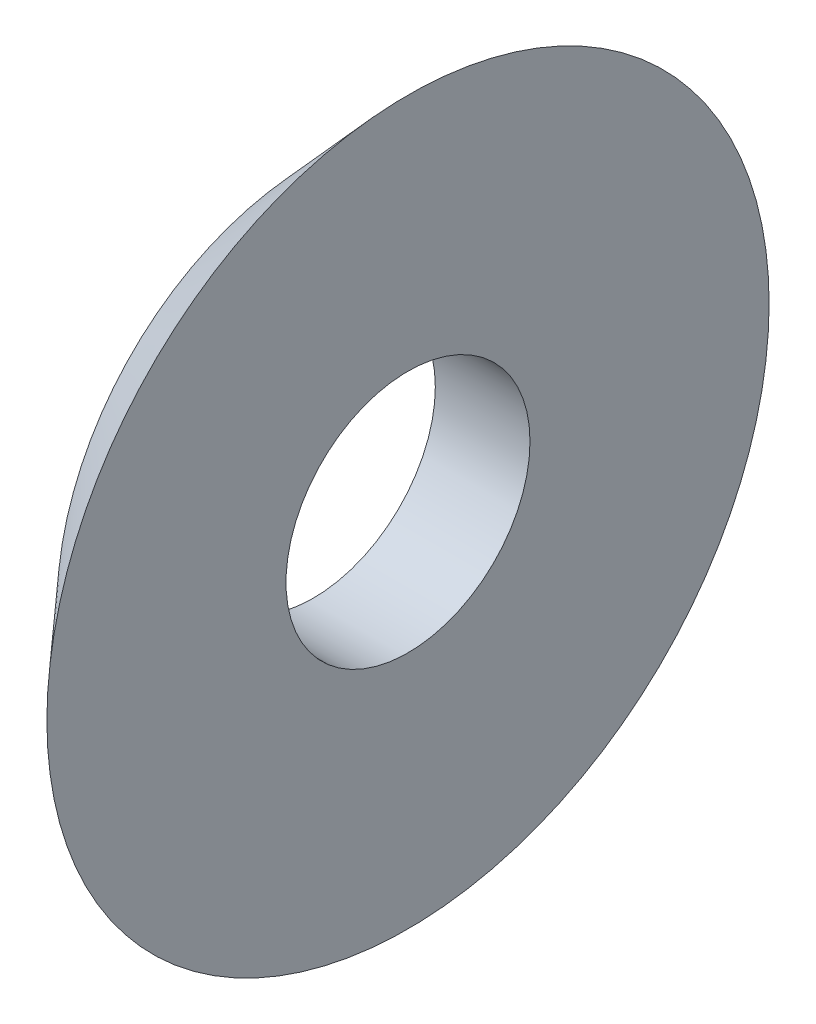
ISO-10303-21;
HEADER;
FILE_DESCRIPTION(('STEP AP214'),'2;1');
FILE_NAME('part.step','',(''),(''),'','','');
FILE_SCHEMA(('AUTOMOTIVE_DESIGN { 1 0 10303 214 1 1 1 1 }'));
ENDSEC;
DATA;
#1=APPLICATION_CONTEXT('core data for automotive mechanical design processes');
#2=APPLICATION_PROTOCOL_DEFINITION('international standard','automotive_design',2000,#1);
#3=PRODUCT_CONTEXT('',#1,'mechanical');
#4=PRODUCT('Part','Part','',(#3));
#5=PRODUCT_RELATED_PRODUCT_CATEGORY('part','',(#4));
#6=PRODUCT_DEFINITION_FORMATION('','',#4);
#7=PRODUCT_DEFINITION_CONTEXT('part definition',#1,'design');
#8=PRODUCT_DEFINITION('design','',#6,#7);
#9=PRODUCT_DEFINITION_SHAPE('','',#8);
#10=(LENGTH_UNIT() NAMED_UNIT(*) SI_UNIT(.MILLI.,.METRE.));
#11=(NAMED_UNIT(*) PLANE_ANGLE_UNIT() SI_UNIT($,.RADIAN.));
#12=(NAMED_UNIT(*) SI_UNIT($,.STERADIAN.) SOLID_ANGLE_UNIT());
#13=UNCERTAINTY_MEASURE_WITH_UNIT(LENGTH_MEASURE(1.E-05),#10,'distance_accuracy_value','');
#14=(GEOMETRIC_REPRESENTATION_CONTEXT(3) GLOBAL_UNCERTAINTY_ASSIGNED_CONTEXT((#13)) GLOBAL_UNIT_ASSIGNED_CONTEXT((#10,
#11,#12)) REPRESENTATION_CONTEXT('',''));
#15=CARTESIAN_POINT('',(0.,0.,0.));
#16=DIRECTION('',(0.,0.,1.));
#17=DIRECTION('',(1.,0.,0.));
#18=AXIS2_PLACEMENT_3D('',#15,#16,#17);
#19=CARTESIAN_POINT('',(0.,0.,0.));
#20=DIRECTION('',(1.,0.,0.));
#21=DIRECTION('',(0.,0.,-1.));
#22=AXIS2_PLACEMENT_3D('',#19,#20,#21);
#23=CONICAL_SURFACE('',#22,7.4,0.836697858156504);
#24=CARTESIAN_POINT('',(-1.94,0.,0.));
#25=DIRECTION('',(1.,0.,0.));
#26=DIRECTION('',(0.,0.,-1.));
#27=AXIS2_PLACEMENT_3D('',#24,#25,#26);
#28=CIRCLE('',#27,5.25);
#29=CARTESIAN_POINT('',(-1.94,0.,-5.25));
#30=VERTEX_POINT('',#29);
#31=EDGE_CURVE('E44',#30,#30,#28,.T.);
#32=ORIENTED_EDGE('',*,*,#31,.T.);
#33=EDGE_LOOP('',(#32));
#34=FACE_BOUND('',#33,.T.);
#35=CARTESIAN_POINT('',(0.,0.,0.));
#36=DIRECTION('',(1.,0.,0.));
#37=DIRECTION('',(0.,0.,-1.));
#38=AXIS2_PLACEMENT_3D('',#35,#36,#37);
#39=CIRCLE('',#38,7.4);
#40=CARTESIAN_POINT('',(0.,0.,-7.4));
#41=VERTEX_POINT('',#40);
#42=EDGE_CURVE('E10',#41,#41,#39,.T.);
#43=ORIENTED_EDGE('',*,*,#42,.F.);
#44=EDGE_LOOP('',(#43));
#45=FACE_BOUND('',#44,.T.);
#46=ADVANCED_FACE('F30',(#34,#45),#23,.T.);
#47=CARTESIAN_POINT('',(0.,7.4,0.));
#48=DIRECTION('',(1.,0.,0.));
#49=DIRECTION('',(0.,0.,-1.));
#50=AXIS2_PLACEMENT_3D('',#47,#48,#49);
#51=PLANE('',#50);
#52=ORIENTED_EDGE('',*,*,#42,.T.);
#53=EDGE_LOOP('',(#52));
#54=FACE_BOUND('',#53,.T.);
#55=CARTESIAN_POINT('',(0.,0.,0.));
#56=DIRECTION('',(1.,0.,0.));
#57=DIRECTION('',(0.,0.,-1.));
#58=AXIS2_PLACEMENT_3D('',#55,#56,#57);
#59=CIRCLE('',#58,2.5);
#60=CARTESIAN_POINT('',(0.,0.,-2.5));
#61=VERTEX_POINT('',#60);
#62=EDGE_CURVE('E36',#61,#61,#59,.T.);
#63=ORIENTED_EDGE('',*,*,#62,.F.);
#64=EDGE_LOOP('',(#63));
#65=FACE_BOUND('',#64,.T.);
#66=ADVANCED_FACE('F60',(#54,#65),#51,.T.);
#67=CARTESIAN_POINT('',(0.,0.,0.));
#68=DIRECTION('',(1.,0.,0.));
#69=DIRECTION('',(0.,0.,-1.));
#70=AXIS2_PLACEMENT_3D('',#67,#68,#69);
#71=CYLINDRICAL_SURFACE('',#70,2.5);
#72=ORIENTED_EDGE('',*,*,#62,.T.);
#73=EDGE_LOOP('',(#72));
#74=FACE_BOUND('',#73,.T.);
#75=CARTESIAN_POINT('',(-1.94,0.,0.));
#76=DIRECTION('',(1.,0.,0.));
#77=DIRECTION('',(0.,0.,-1.));
#78=AXIS2_PLACEMENT_3D('',#75,#76,#77);
#79=CIRCLE('',#78,2.5);
#80=CARTESIAN_POINT('',(-1.94,0.,-2.5));
#81=VERTEX_POINT('',#80);
#82=EDGE_CURVE('E40',#81,#81,#79,.T.);
#83=ORIENTED_EDGE('',*,*,#82,.F.);
#84=EDGE_LOOP('',(#83));
#85=FACE_BOUND('',#84,.T.);
#86=ADVANCED_FACE('F54',(#74,#85),#71,.F.);
#87=CARTESIAN_POINT('',(-1.94,2.5,0.));
#88=DIRECTION('',(-1.,0.,0.));
#89=DIRECTION('',(0.,0.,1.));
#90=AXIS2_PLACEMENT_3D('',#87,#88,#89);
#91=PLANE('',#90);
#92=ORIENTED_EDGE('',*,*,#82,.T.);
#93=EDGE_LOOP('',(#92));
#94=FACE_BOUND('',#93,.T.);
#95=ORIENTED_EDGE('',*,*,#31,.F.);
#96=EDGE_LOOP('',(#95));
#97=FACE_BOUND('',#96,.T.);
#98=ADVANCED_FACE('F52',(#94,#97),#91,.T.);
#99=CLOSED_SHELL('',(#46,#66,#86,#98));
#100=MANIFOLD_SOLID_BREP('B2',#99);
#101=ADVANCED_BREP_SHAPE_REPRESENTATION('',(#18,#100),#14);
#102=SHAPE_DEFINITION_REPRESENTATION(#9,#101);
ENDSEC;
END-ISO-10303-21;
